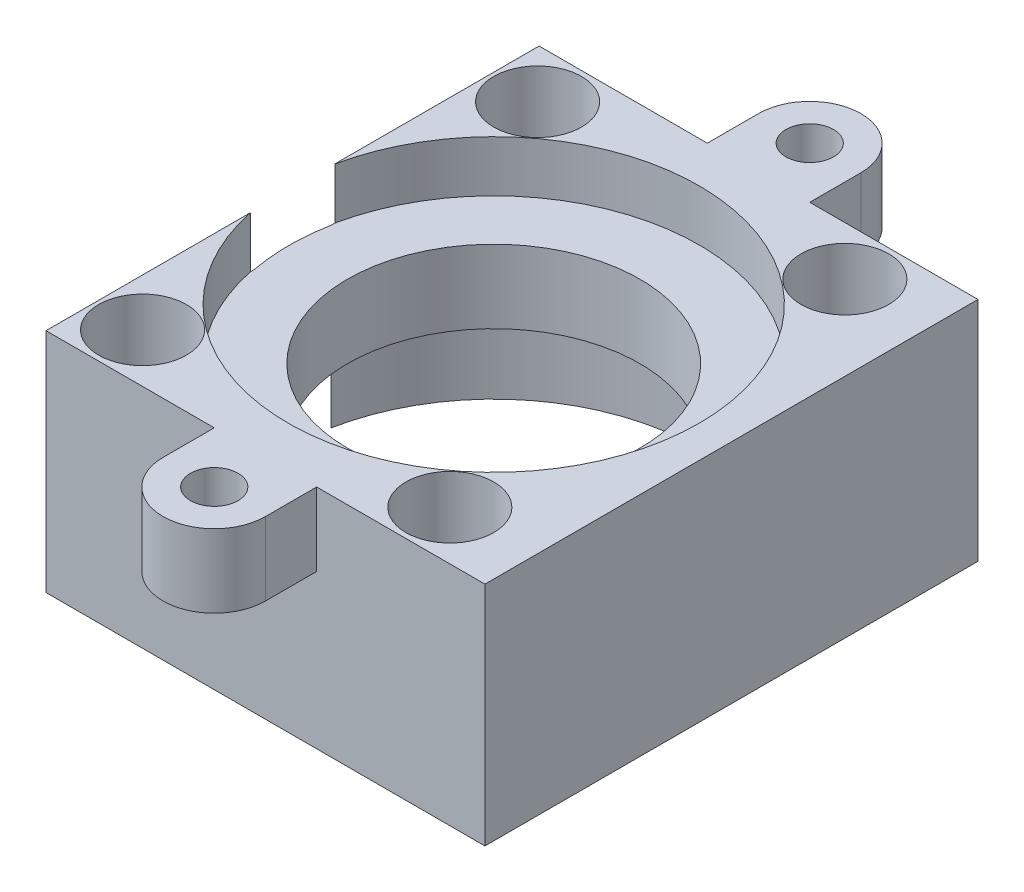
ISO-10303-21;
HEADER;
FILE_DESCRIPTION(('STEP AP214'),'2;1');
FILE_NAME('part.step','',(''),(''),'','','');
FILE_SCHEMA(('AUTOMOTIVE_DESIGN { 1 0 10303 214 1 1 1 1 }'));
ENDSEC;
DATA;
#1=APPLICATION_CONTEXT('core data for automotive mechanical design processes');
#2=APPLICATION_PROTOCOL_DEFINITION('international standard','automotive_design',2000,#1);
#3=PRODUCT_CONTEXT('',#1,'mechanical');
#4=PRODUCT('Part','Part','',(#3));
#5=PRODUCT_RELATED_PRODUCT_CATEGORY('part','',(#4));
#6=PRODUCT_DEFINITION_FORMATION('','',#4);
#7=PRODUCT_DEFINITION_CONTEXT('part definition',#1,'design');
#8=PRODUCT_DEFINITION('design','',#6,#7);
#9=PRODUCT_DEFINITION_SHAPE('','',#8);
#10=(LENGTH_UNIT() NAMED_UNIT(*) SI_UNIT(.MILLI.,.METRE.));
#11=(NAMED_UNIT(*) PLANE_ANGLE_UNIT() SI_UNIT($,.RADIAN.));
#12=(NAMED_UNIT(*) SI_UNIT($,.STERADIAN.) SOLID_ANGLE_UNIT());
#13=UNCERTAINTY_MEASURE_WITH_UNIT(LENGTH_MEASURE(1.E-05),#10,'distance_accuracy_value','');
#14=(GEOMETRIC_REPRESENTATION_CONTEXT(3) GLOBAL_UNCERTAINTY_ASSIGNED_CONTEXT((#13)) GLOBAL_UNIT_ASSIGNED_CONTEXT((#10,
#11,#12)) REPRESENTATION_CONTEXT('',''));
#15=CARTESIAN_POINT('',(0.,0.,0.));
#16=DIRECTION('',(0.,0.,1.));
#17=DIRECTION('',(1.,0.,0.));
#18=AXIS2_PLACEMENT_3D('',#15,#16,#17);
#19=CARTESIAN_POINT('',(-11.75,15.,13.5));
#20=DIRECTION('',(0.,-1.,0.));
#21=DIRECTION('',(0.,0.,-1.));
#22=AXIS2_PLACEMENT_3D('',#19,#20,#21);
#23=CYLINDRICAL_SURFACE('',#22,1.375);
#24=CARTESIAN_POINT('',(-11.75,0.,13.5));
#25=DIRECTION('',(0.,1.,0.));
#26=DIRECTION('',(0.,0.,1.));
#27=AXIS2_PLACEMENT_3D('',#24,#25,#26);
#28=CIRCLE('',#27,1.375);
#29=CARTESIAN_POINT('',(-11.75,0.,14.875));
#30=VERTEX_POINT('',#29);
#31=EDGE_CURVE('E375',#30,#30,#28,.T.);
#32=ORIENTED_EDGE('',*,*,#31,.F.);
#33=EDGE_LOOP('',(#32));
#34=FACE_BOUND('',#33,.T.);
#35=CARTESIAN_POINT('',(-11.75,3.,13.5));
#36=DIRECTION('',(0.,1.,0.));
#37=DIRECTION('',(0.,0.,1.));
#38=AXIS2_PLACEMENT_3D('',#35,#36,#37);
#39=CIRCLE('',#38,1.375);
#40=CARTESIAN_POINT('',(-11.75,3.,14.875));
#41=VERTEX_POINT('',#40);
#42=EDGE_CURVE('E245',#41,#41,#39,.T.);
#43=ORIENTED_EDGE('',*,*,#42,.T.);
#44=EDGE_LOOP('',(#43));
#45=FACE_BOUND('',#44,.T.);
#46=ADVANCED_FACE('F40',(#34,#45),#23,.F.);
#47=CARTESIAN_POINT('',(9.25,15.,13.5));
#48=DIRECTION('',(0.,-1.,0.));
#49=DIRECTION('',(0.,0.,-1.));
#50=AXIS2_PLACEMENT_3D('',#47,#48,#49);
#51=CYLINDRICAL_SURFACE('',#50,1.46084532642088);
#52=CARTESIAN_POINT('',(9.25,0.,13.5));
#53=DIRECTION('',(0.,1.,0.));
#54=DIRECTION('',(0.,0.,1.));
#55=AXIS2_PLACEMENT_3D('',#52,#53,#54);
#56=CIRCLE('',#55,1.46084532642088);
#57=CARTESIAN_POINT('',(9.25,0.,14.9608453264209));
#58=VERTEX_POINT('',#57);
#59=EDGE_CURVE('E371',#58,#58,#56,.T.);
#60=ORIENTED_EDGE('',*,*,#59,.F.);
#61=EDGE_LOOP('',(#60));
#62=FACE_BOUND('',#61,.T.);
#63=CARTESIAN_POINT('',(9.25,3.,13.5));
#64=DIRECTION('',(0.,1.,0.));
#65=DIRECTION('',(0.,0.,1.));
#66=AXIS2_PLACEMENT_3D('',#63,#64,#65);
#67=CIRCLE('',#66,1.46084532642088);
#68=CARTESIAN_POINT('',(9.25,3.,14.9608453264209));
#69=VERTEX_POINT('',#68);
#70=EDGE_CURVE('E409',#69,#69,#67,.T.);
#71=ORIENTED_EDGE('',*,*,#70,.T.);
#72=EDGE_LOOP('',(#71));
#73=FACE_BOUND('',#72,.T.);
#74=ADVANCED_FACE('F465',(#62,#73),#51,.F.);
#75=CARTESIAN_POINT('',(9.24999999999999,15.,-13.5));
#76=DIRECTION('',(0.,-1.,0.));
#77=DIRECTION('',(0.,0.,-1.));
#78=AXIS2_PLACEMENT_3D('',#75,#76,#77);
#79=CYLINDRICAL_SURFACE('',#78,1.48065528185077);
#80=CARTESIAN_POINT('',(9.24999999999999,0.,-13.5));
#81=DIRECTION('',(0.,1.,0.));
#82=DIRECTION('',(0.,0.,1.));
#83=AXIS2_PLACEMENT_3D('',#80,#81,#82);
#84=CIRCLE('',#83,1.48065528185077);
#85=CARTESIAN_POINT('',(9.24999999999999,0.,-12.0193447181492));
#86=VERTEX_POINT('',#85);
#87=EDGE_CURVE('E367',#86,#86,#84,.T.);
#88=ORIENTED_EDGE('',*,*,#87,.F.);
#89=EDGE_LOOP('',(#88));
#90=FACE_BOUND('',#89,.T.);
#91=CARTESIAN_POINT('',(9.24999999999999,3.,-13.5));
#92=DIRECTION('',(0.,1.,0.));
#93=DIRECTION('',(0.,0.,1.));
#94=AXIS2_PLACEMENT_3D('',#91,#92,#93);
#95=CIRCLE('',#94,1.48065528185077);
#96=CARTESIAN_POINT('',(9.24999999999999,3.,-12.0193447181492));
#97=VERTEX_POINT('',#96);
#98=EDGE_CURVE('E405',#97,#97,#95,.T.);
#99=ORIENTED_EDGE('',*,*,#98,.T.);
#100=EDGE_LOOP('',(#99));
#101=FACE_BOUND('',#100,.T.);
#102=ADVANCED_FACE('F472',(#90,#101),#79,.F.);
#103=CARTESIAN_POINT('',(-11.75,15.,-13.5));
#104=DIRECTION('',(0.,-1.,0.));
#105=DIRECTION('',(0.,0.,-1.));
#106=AXIS2_PLACEMENT_3D('',#103,#104,#105);
#107=CYLINDRICAL_SURFACE('',#106,1.375);
#108=CARTESIAN_POINT('',(-11.75,0.,-13.5));
#109=DIRECTION('',(0.,1.,0.));
#110=DIRECTION('',(0.,0.,1.));
#111=AXIS2_PLACEMENT_3D('',#108,#109,#110);
#112=CIRCLE('',#111,1.375);
#113=CARTESIAN_POINT('',(-11.75,0.,-12.125));
#114=VERTEX_POINT('',#113);
#115=EDGE_CURVE('E379',#114,#114,#112,.T.);
#116=ORIENTED_EDGE('',*,*,#115,.F.);
#117=EDGE_LOOP('',(#116));
#118=FACE_BOUND('',#117,.T.);
#119=CARTESIAN_POINT('',(-11.75,3.,-13.5));
#120=DIRECTION('',(0.,1.,0.));
#121=DIRECTION('',(0.,0.,1.));
#122=AXIS2_PLACEMENT_3D('',#119,#120,#121);
#123=CIRCLE('',#122,1.375);
#124=CARTESIAN_POINT('',(-11.75,3.,-12.125));
#125=VERTEX_POINT('',#124);
#126=EDGE_CURVE('E216',#125,#125,#123,.T.);
#127=ORIENTED_EDGE('',*,*,#126,.T.);
#128=EDGE_LOOP('',(#127));
#129=FACE_BOUND('',#128,.T.);
#130=ADVANCED_FACE('F477',(#118,#129),#107,.F.);
#131=CARTESIAN_POINT('',(0.,15.,-16.85));
#132=DIRECTION('',(0.,0.,1.));
#133=DIRECTION('',(1.,0.,0.));
#134=AXIS2_PLACEMENT_3D('',#131,#132,#133);
#135=PLANE('',#134);
#136=DIRECTION('',(0.,1.,0.));
#137=VECTOR('',#136,1.);
#138=CARTESIAN_POINT('',(-3.5,10.5,-16.85));
#139=LINE('',#138,#137);
#140=CARTESIAN_POINT('',(-3.5,10.5,-16.85));
#141=VERTEX_POINT('',#140);
#142=CARTESIAN_POINT('',(-3.5,15.5,-16.85));
#143=VERTEX_POINT('',#142);
#144=EDGE_CURVE('E307',#141,#143,#139,.T.);
#145=ORIENTED_EDGE('',*,*,#144,.F.);
#146=DIRECTION('',(-1.,0.,0.));
#147=VECTOR('',#146,1.);
#148=CARTESIAN_POINT('',(0.,10.5,-16.85));
#149=LINE('',#148,#147);
#150=CARTESIAN_POINT('',(3.5,10.5,-16.85));
#151=VERTEX_POINT('',#150);
#152=EDGE_CURVE('E275',#151,#141,#149,.T.);
#153=ORIENTED_EDGE('',*,*,#152,.F.);
#154=DIRECTION('',(0.,1.,0.));
#155=VECTOR('',#154,1.);
#156=CARTESIAN_POINT('',(3.5,10.5,-16.85));
#157=LINE('',#156,#155);
#158=CARTESIAN_POINT('',(3.5,15.5,-16.85));
#159=VERTEX_POINT('',#158);
#160=EDGE_CURVE('E303',#151,#159,#157,.T.);
#161=ORIENTED_EDGE('',*,*,#160,.T.);
#162=DIRECTION('',(-1.,0.,0.));
#163=VECTOR('',#162,1.);
#164=CARTESIAN_POINT('',(0.,15.5,-16.85));
#165=LINE('',#164,#163);
#166=CARTESIAN_POINT('',(15.,15.5,-16.85));
#167=VERTEX_POINT('',#166);
#168=EDGE_CURVE('E327',#167,#159,#165,.T.);
#169=ORIENTED_EDGE('',*,*,#168,.F.);
#170=DIRECTION('',(0.,-1.,0.));
#171=VECTOR('',#170,1.);
#172=CARTESIAN_POINT('',(15.,15.,-16.85));
#173=LINE('',#172,#171);
#174=CARTESIAN_POINT('',(15.,0.,-16.85));
#175=VERTEX_POINT('',#174);
#176=EDGE_CURVE('E389',#167,#175,#173,.T.);
#177=ORIENTED_EDGE('',*,*,#176,.T.);
#178=DIRECTION('',(-1.,0.,0.));
#179=VECTOR('',#178,1.);
#180=CARTESIAN_POINT('',(0.,0.,-16.85));
#181=LINE('',#180,#179);
#182=CARTESIAN_POINT('',(-15.,0.,-16.85));
#183=VERTEX_POINT('',#182);
#184=EDGE_CURVE('E363',#175,#183,#181,.T.);
#185=ORIENTED_EDGE('',*,*,#184,.T.);
#186=DIRECTION('',(0.,-1.,0.));
#187=VECTOR('',#186,1.);
#188=CARTESIAN_POINT('',(-15.,15.,-16.85));
#189=LINE('',#188,#187);
#190=CARTESIAN_POINT('',(-15.,15.5,-16.85));
#191=VERTEX_POINT('',#190);
#192=EDGE_CURVE('E386',#191,#183,#189,.T.);
#193=ORIENTED_EDGE('',*,*,#192,.F.);
#194=EDGE_CURVE('E326',#143,#191,#165,.T.);
#195=ORIENTED_EDGE('',*,*,#194,.F.);
#196=EDGE_LOOP('',(#145,#153,#161,#169,#177,#185,#193,#195));
#197=FACE_BOUND('',#196,.T.);
#198=ADVANCED_FACE('F488',(#197),#135,.F.);
#199=CARTESIAN_POINT('',(-1.25,7.,0.));
#200=DIRECTION('',(0.,1.,0.));
#201=DIRECTION('',(0.,0.,1.));
#202=AXIS2_PLACEMENT_3D('',#199,#200,#201);
#203=CYLINDRICAL_SURFACE('',#202,14.);
#204=DIRECTION('',(0.,-1.,0.));
#205=VECTOR('',#204,1.);
#206=CARTESIAN_POINT('',(-15.,15.,2.63391343821319));
#207=LINE('',#206,#205);
#208=CARTESIAN_POINT('',(-15.,12.,2.63391343821319));
#209=VERTEX_POINT('',#208);
#210=CARTESIAN_POINT('',(-15.,7.,2.63391343821319));
#211=VERTEX_POINT('',#210);
#212=EDGE_CURVE('E49',#209,#211,#207,.T.);
#213=ORIENTED_EDGE('',*,*,#212,.F.);
#214=CARTESIAN_POINT('',(-1.25,12.,0.));
#215=DIRECTION('',(0.,1.,0.));
#216=DIRECTION('',(0.,0.,1.));
#217=AXIS2_PLACEMENT_3D('',#214,#215,#216);
#218=CIRCLE('',#217,14.);
#219=CARTESIAN_POINT('',(-15.,12.,-2.63391343821319));
#220=VERTEX_POINT('',#219);
#221=EDGE_CURVE('E335',#220,#209,#218,.T.);
#222=ORIENTED_EDGE('',*,*,#221,.F.);
#223=DIRECTION('',(0.,-1.,0.));
#224=VECTOR('',#223,1.);
#225=CARTESIAN_POINT('',(-15.,15.,-2.63391343821319));
#226=LINE('',#225,#224);
#227=CARTESIAN_POINT('',(-15.,7.,-2.63391343821319));
#228=VERTEX_POINT('',#227);
#229=EDGE_CURVE('E179',#220,#228,#226,.T.);
#230=ORIENTED_EDGE('',*,*,#229,.T.);
#231=CARTESIAN_POINT('',(-1.25,7.,0.));
#232=DIRECTION('',(0.,1.,0.));
#233=DIRECTION('',(0.,0.,1.));
#234=AXIS2_PLACEMENT_3D('',#231,#232,#233);
#235=CIRCLE('',#234,14.);
#236=EDGE_CURVE('E343',#228,#211,#235,.T.);
#237=ORIENTED_EDGE('',*,*,#236,.T.);
#238=EDGE_LOOP('',(#213,#222,#230,#237));
#239=FACE_BOUND('',#238,.T.);
#240=ADVANCED_FACE('F491',(#239),#203,.T.);
#241=CARTESIAN_POINT('',(-1.25,7.,0.));
#242=DIRECTION('',(0.,1.,0.));
#243=DIRECTION('',(0.,0.,1.));
#244=AXIS2_PLACEMENT_3D('',#241,#242,#243);
#245=CYLINDRICAL_SURFACE('',#244,10.);
#246=CARTESIAN_POINT('',(-1.25,7.,0.));
#247=DIRECTION('',(0.,1.,0.));
#248=DIRECTION('',(0.,0.,1.));
#249=AXIS2_PLACEMENT_3D('',#246,#247,#248);
#250=CIRCLE('',#249,10.);
#251=CARTESIAN_POINT('',(-1.25,7.,10.));
#252=VERTEX_POINT('',#251);
#253=EDGE_CURVE('E338',#252,#252,#250,.T.);
#254=ORIENTED_EDGE('',*,*,#253,.F.);
#255=EDGE_LOOP('',(#254));
#256=FACE_BOUND('',#255,.T.);
#257=CARTESIAN_POINT('',(-1.25,12.,0.));
#258=DIRECTION('',(0.,1.,0.));
#259=DIRECTION('',(0.,0.,1.));
#260=AXIS2_PLACEMENT_3D('',#257,#258,#259);
#261=CIRCLE('',#260,10.);
#262=CARTESIAN_POINT('',(-1.25,12.,10.));
#263=VERTEX_POINT('',#262);
#264=EDGE_CURVE('E331',#263,#263,#261,.T.);
#265=ORIENTED_EDGE('',*,*,#264,.T.);
#266=EDGE_LOOP('',(#265));
#267=FACE_BOUND('',#266,.T.);
#268=ADVANCED_FACE('F561',(#256,#267),#245,.F.);
#269=CARTESIAN_POINT('',(-1.25,15.,0.));
#270=DIRECTION('',(0.,-1.,0.));
#271=DIRECTION('',(0.,0.,-1.));
#272=AXIS2_PLACEMENT_3D('',#269,#270,#271);
#273=CYLINDRICAL_SURFACE('',#272,14.);
#274=CARTESIAN_POINT('',(-15.,0.,2.63391343821319));
#275=VERTEX_POINT('',#274);
#276=EDGE_CURVE('E399',#211,#275,#207,.T.);
#277=ORIENTED_EDGE('',*,*,#276,.F.);
#278=EDGE_CURVE('E342',#211,#228,#235,.T.);
#279=ORIENTED_EDGE('',*,*,#278,.T.);
#280=CARTESIAN_POINT('',(-15.,0.,-2.63391343821319));
#281=VERTEX_POINT('',#280);
#282=EDGE_CURVE('E383',#228,#281,#226,.T.);
#283=ORIENTED_EDGE('',*,*,#282,.T.);
#284=CARTESIAN_POINT('',(-1.25,0.,0.));
#285=DIRECTION('',(0.,1.,0.));
#286=DIRECTION('',(0.,0.,1.));
#287=AXIS2_PLACEMENT_3D('',#284,#285,#286);
#288=CIRCLE('',#287,14.);
#289=EDGE_CURVE('E347',#275,#281,#288,.T.);
#290=ORIENTED_EDGE('',*,*,#289,.F.);
#291=EDGE_LOOP('',(#277,#279,#283,#290));
#292=FACE_BOUND('',#291,.T.);
#293=ADVANCED_FACE('F42',(#292),#273,.F.);
#294=CARTESIAN_POINT('',(-15.,15.,0.));
#295=DIRECTION('',(-1.,0.,0.));
#296=DIRECTION('',(0.,0.,1.));
#297=AXIS2_PLACEMENT_3D('',#294,#295,#296);
#298=PLANE('',#297);
#299=DIRECTION('',(0.,1.,0.));
#300=VECTOR('',#299,1.);
#301=CARTESIAN_POINT('',(-15.,12.,2.88790581563874));
#302=LINE('',#301,#300);
#303=CARTESIAN_POINT('',(-15.,12.,2.88790581563874));
#304=VERTEX_POINT('',#303);
#305=CARTESIAN_POINT('',(-15.,15.5,2.88790581563874));
#306=VERTEX_POINT('',#305);
#307=EDGE_CURVE('E55',#304,#306,#302,.T.);
#308=ORIENTED_EDGE('',*,*,#307,.F.);
#309=DIRECTION('',(0.,0.,-1.));
#310=VECTOR('',#309,1.);
#311=CARTESIAN_POINT('',(-15.,12.,0.));
#312=LINE('',#311,#310);
#313=EDGE_CURVE('E173',#304,#209,#312,.T.);
#314=ORIENTED_EDGE('',*,*,#313,.T.);
#315=ORIENTED_EDGE('',*,*,#212,.T.);
#316=ORIENTED_EDGE('',*,*,#276,.T.);
#317=DIRECTION('',(0.,0.,-1.));
#318=VECTOR('',#317,1.);
#319=CARTESIAN_POINT('',(-15.,0.,0.));
#320=LINE('',#319,#318);
#321=CARTESIAN_POINT('',(-15.,0.,16.85));
#322=VERTEX_POINT('',#321);
#323=EDGE_CURVE('E351',#322,#275,#320,.T.);
#324=ORIENTED_EDGE('',*,*,#323,.F.);
#325=DIRECTION('',(0.,-1.,0.));
#326=VECTOR('',#325,1.);
#327=CARTESIAN_POINT('',(-15.,15.,16.85));
#328=LINE('',#327,#326);
#329=CARTESIAN_POINT('',(-15.,15.5,16.85));
#330=VERTEX_POINT('',#329);
#331=EDGE_CURVE('E396',#330,#322,#328,.T.);
#332=ORIENTED_EDGE('',*,*,#331,.F.);
#333=DIRECTION('',(0.,0.,1.));
#334=VECTOR('',#333,1.);
#335=CARTESIAN_POINT('',(-15.,15.5,0.));
#336=LINE('',#335,#334);
#337=EDGE_CURVE('E314',#306,#330,#336,.T.);
#338=ORIENTED_EDGE('',*,*,#337,.F.);
#339=EDGE_LOOP('',(#308,#314,#315,#316,#324,#332,#338));
#340=FACE_BOUND('',#339,.T.);
#341=ADVANCED_FACE('F487',(#340),#298,.T.);
#342=CARTESIAN_POINT('',(0.,15.,16.85));
#343=DIRECTION('',(0.,0.,1.));
#344=DIRECTION('',(1.,0.,0.));
#345=AXIS2_PLACEMENT_3D('',#342,#343,#344);
#346=PLANE('',#345);
#347=DIRECTION('',(0.,1.,0.));
#348=VECTOR('',#347,1.);
#349=CARTESIAN_POINT('',(3.5,10.5,16.85));
#350=LINE('',#349,#348);
#351=CARTESIAN_POINT('',(3.5,10.5,16.85));
#352=VERTEX_POINT('',#351);
#353=CARTESIAN_POINT('',(3.5,15.5,16.85));
#354=VERTEX_POINT('',#353);
#355=EDGE_CURVE('E261',#352,#354,#350,.T.);
#356=ORIENTED_EDGE('',*,*,#355,.F.);
#357=DIRECTION('',(1.,0.,0.));
#358=VECTOR('',#357,1.);
#359=CARTESIAN_POINT('',(0.,10.5,16.85));
#360=LINE('',#359,#358);
#361=CARTESIAN_POINT('',(-3.5,10.5,16.85));
#362=VERTEX_POINT('',#361);
#363=EDGE_CURVE('E228',#362,#352,#360,.T.);
#364=ORIENTED_EDGE('',*,*,#363,.F.);
#365=DIRECTION('',(0.,1.,0.));
#366=VECTOR('',#365,1.);
#367=CARTESIAN_POINT('',(-3.5,10.5,16.85));
#368=LINE('',#367,#366);
#369=CARTESIAN_POINT('',(-3.5,15.5,16.85));
#370=VERTEX_POINT('',#369);
#371=EDGE_CURVE('E258',#362,#370,#368,.T.);
#372=ORIENTED_EDGE('',*,*,#371,.T.);
#373=DIRECTION('',(1.,0.,0.));
#374=VECTOR('',#373,1.);
#375=CARTESIAN_POINT('',(0.,15.5,16.85));
#376=LINE('',#375,#374);
#377=EDGE_CURVE('E318',#330,#370,#376,.T.);
#378=ORIENTED_EDGE('',*,*,#377,.F.);
#379=ORIENTED_EDGE('',*,*,#331,.T.);
#380=DIRECTION('',(-1.,0.,0.));
#381=VECTOR('',#380,1.);
#382=CARTESIAN_POINT('',(0.,0.,16.85));
#383=LINE('',#382,#381);
#384=CARTESIAN_POINT('',(15.,0.,16.85));
#385=VERTEX_POINT('',#384);
#386=EDGE_CURVE('E355',#385,#322,#383,.T.);
#387=ORIENTED_EDGE('',*,*,#386,.F.);
#388=DIRECTION('',(0.,-1.,0.));
#389=VECTOR('',#388,1.);
#390=CARTESIAN_POINT('',(15.,15.,16.85));
#391=LINE('',#390,#389);
#392=CARTESIAN_POINT('',(15.,15.5,16.85));
#393=VERTEX_POINT('',#392);
#394=EDGE_CURVE('E393',#393,#385,#391,.T.);
#395=ORIENTED_EDGE('',*,*,#394,.F.);
#396=EDGE_CURVE('E317',#354,#393,#376,.T.);
#397=ORIENTED_EDGE('',*,*,#396,.F.);
#398=EDGE_LOOP('',(#356,#364,#372,#378,#379,#387,#395,#397));
#399=FACE_BOUND('',#398,.T.);
#400=ADVANCED_FACE('F494',(#399),#346,.T.);
#401=CARTESIAN_POINT('',(15.,15.,0.));
#402=DIRECTION('',(-1.,0.,0.));
#403=DIRECTION('',(0.,0.,1.));
#404=AXIS2_PLACEMENT_3D('',#401,#402,#403);
#405=PLANE('',#404);
#406=DIRECTION('',(0.,0.,-1.));
#407=VECTOR('',#406,1.);
#408=CARTESIAN_POINT('',(15.,0.,0.));
#409=LINE('',#408,#407);
#410=EDGE_CURVE('E360',#385,#175,#409,.T.);
#411=ORIENTED_EDGE('',*,*,#410,.T.);
#412=ORIENTED_EDGE('',*,*,#176,.F.);
#413=DIRECTION('',(0.,0.,-1.));
#414=VECTOR('',#413,1.);
#415=CARTESIAN_POINT('',(15.,15.5,0.));
#416=LINE('',#415,#414);
#417=EDGE_CURVE('E322',#393,#167,#416,.T.);
#418=ORIENTED_EDGE('',*,*,#417,.F.);
#419=ORIENTED_EDGE('',*,*,#394,.T.);
#420=EDGE_LOOP('',(#411,#412,#418,#419));
#421=FACE_BOUND('',#420,.T.);
#422=ADVANCED_FACE('F486',(#421),#405,.F.);
#423=DIRECTION('',(0.,1.,0.));
#424=VECTOR('',#423,1.);
#425=CARTESIAN_POINT('',(-15.,12.,-2.88790581563874));
#426=LINE('',#425,#424);
#427=CARTESIAN_POINT('',(-15.,15.5,-2.88790581563874));
#428=VERTEX_POINT('',#427);
#429=CARTESIAN_POINT('',(-15.,12.,-2.88790581563874));
#430=VERTEX_POINT('',#429);
#431=EDGE_CURVE('E158',#428,#430,#426,.F.);
#432=ORIENTED_EDGE('',*,*,#431,.F.);
#433=DIRECTION('',(0.,0.,1.));
#434=VECTOR('',#433,1.);
#435=CARTESIAN_POINT('',(-15.,15.5,0.));
#436=LINE('',#435,#434);
#437=EDGE_CURVE('E302',#191,#428,#436,.T.);
#438=ORIENTED_EDGE('',*,*,#437,.F.);
#439=ORIENTED_EDGE('',*,*,#192,.T.);
#440=EDGE_CURVE('E356',#281,#183,#320,.T.);
#441=ORIENTED_EDGE('',*,*,#440,.F.);
#442=ORIENTED_EDGE('',*,*,#282,.F.);
#443=ORIENTED_EDGE('',*,*,#229,.F.);
#444=DIRECTION('',(0.,0.,-1.));
#445=VECTOR('',#444,1.);
#446=CARTESIAN_POINT('',(-15.,12.,0.));
#447=LINE('',#446,#445);
#448=EDGE_CURVE('E171',#220,#430,#447,.T.);
#449=ORIENTED_EDGE('',*,*,#448,.T.);
#450=EDGE_LOOP('',(#432,#438,#439,#441,#442,#443,#449));
#451=FACE_BOUND('',#450,.T.);
#452=ADVANCED_FACE('F177',(#451),#298,.T.);
#453=CARTESIAN_POINT('',(0.,0.,0.));
#454=DIRECTION('',(0.,1.,0.));
#455=DIRECTION('',(0.,0.,1.));
#456=AXIS2_PLACEMENT_3D('',#453,#454,#455);
#457=PLANE('',#456);
#458=ORIENTED_EDGE('',*,*,#289,.T.);
#459=ORIENTED_EDGE('',*,*,#440,.T.);
#460=ORIENTED_EDGE('',*,*,#184,.F.);
#461=ORIENTED_EDGE('',*,*,#410,.F.);
#462=ORIENTED_EDGE('',*,*,#386,.T.);
#463=ORIENTED_EDGE('',*,*,#323,.T.);
#464=EDGE_LOOP('',(#458,#459,#460,#461,#462,#463));
#465=FACE_BOUND('',#464,.T.);
#466=ORIENTED_EDGE('',*,*,#87,.T.);
#467=EDGE_LOOP('',(#466));
#468=FACE_BOUND('',#467,.T.);
#469=ORIENTED_EDGE('',*,*,#59,.T.);
#470=EDGE_LOOP('',(#469));
#471=FACE_BOUND('',#470,.T.);
#472=ORIENTED_EDGE('',*,*,#31,.T.);
#473=EDGE_LOOP('',(#472));
#474=FACE_BOUND('',#473,.T.);
#475=ORIENTED_EDGE('',*,*,#115,.T.);
#476=EDGE_LOOP('',(#475));
#477=FACE_BOUND('',#476,.T.);
#478=ADVANCED_FACE('F485',(#465,#468,#471,#474,#477),#457,.F.);
#479=CARTESIAN_POINT('',(-1.25,7.,0.));
#480=DIRECTION('',(0.,1.,0.));
#481=DIRECTION('',(0.,0.,1.));
#482=AXIS2_PLACEMENT_3D('',#479,#480,#481);
#483=PLANE('',#482);
#484=ORIENTED_EDGE('',*,*,#253,.T.);
#485=EDGE_LOOP('',(#484));
#486=FACE_BOUND('',#485,.T.);
#487=ORIENTED_EDGE('',*,*,#236,.F.);
#488=ORIENTED_EDGE('',*,*,#278,.F.);
#489=EDGE_LOOP('',(#487,#488));
#490=FACE_BOUND('',#489,.T.);
#491=ADVANCED_FACE('F558',(#486,#490),#483,.F.);
#492=CARTESIAN_POINT('',(-1.25,12.,0.));
#493=DIRECTION('',(0.,1.,0.));
#494=DIRECTION('',(0.,0.,1.));
#495=AXIS2_PLACEMENT_3D('',#492,#493,#494);
#496=PLANE('',#495);
#497=ORIENTED_EDGE('',*,*,#264,.F.);
#498=EDGE_LOOP('',(#497));
#499=FACE_BOUND('',#498,.T.);
#500=ORIENTED_EDGE('',*,*,#221,.T.);
#501=ORIENTED_EDGE('',*,*,#313,.F.);
#502=CARTESIAN_POINT('',(-1.25,12.,0.));
#503=DIRECTION('',(0.,1.,0.));
#504=DIRECTION('',(0.,0.,1.));
#505=AXIS2_PLACEMENT_3D('',#502,#503,#504);
#506=CIRCLE('',#505,14.05);
#507=EDGE_CURVE('E161',#304,#430,#506,.T.);
#508=ORIENTED_EDGE('',*,*,#507,.T.);
#509=ORIENTED_EDGE('',*,*,#448,.F.);
#510=EDGE_LOOP('',(#500,#501,#508,#509));
#511=FACE_BOUND('',#510,.T.);
#512=ADVANCED_FACE('F170',(#499,#511),#496,.T.);
#513=CARTESIAN_POINT('',(0.,15.5,0.));
#514=DIRECTION('',(0.,1.,0.));
#515=DIRECTION('',(0.,0.,1.));
#516=AXIS2_PLACEMENT_3D('',#513,#514,#515);
#517=PLANE('',#516);
#518=CARTESIAN_POINT('',(-1.25,15.5,0.));
#519=DIRECTION('',(0.,1.,0.));
#520=DIRECTION('',(0.,0.,1.));
#521=AXIS2_PLACEMENT_3D('',#518,#519,#520);
#522=CIRCLE('',#521,14.05);
#523=EDGE_CURVE('E11',#306,#428,#522,.T.);
#524=ORIENTED_EDGE('',*,*,#523,.F.);
#525=ORIENTED_EDGE('',*,*,#337,.T.);
#526=ORIENTED_EDGE('',*,*,#377,.T.);
#527=DIRECTION('',(0.,0.,1.));
#528=VECTOR('',#527,1.);
#529=CARTESIAN_POINT('',(-3.5,15.5,0.));
#530=LINE('',#529,#528);
#531=CARTESIAN_POINT('',(-3.5,15.5,20.35));
#532=VERTEX_POINT('',#531);
#533=EDGE_CURVE('E63',#370,#532,#530,.T.);
#534=ORIENTED_EDGE('',*,*,#533,.T.);
#535=CARTESIAN_POINT('',(0.,15.5,20.35));
#536=DIRECTION('',(0.,1.,0.));
#537=DIRECTION('',(0.,0.,1.));
#538=AXIS2_PLACEMENT_3D('',#535,#536,#537);
#539=CIRCLE('',#538,3.5);
#540=CARTESIAN_POINT('',(3.5,15.5,20.35));
#541=VERTEX_POINT('',#540);
#542=EDGE_CURVE('E240',#532,#541,#539,.T.);
#543=ORIENTED_EDGE('',*,*,#542,.T.);
#544=DIRECTION('',(0.,0.,1.));
#545=VECTOR('',#544,1.);
#546=CARTESIAN_POINT('',(3.5,15.5,0.));
#547=LINE('',#546,#545);
#548=EDGE_CURVE('E244',#354,#541,#547,.T.);
#549=ORIENTED_EDGE('',*,*,#548,.F.);
#550=ORIENTED_EDGE('',*,*,#396,.T.);
#551=ORIENTED_EDGE('',*,*,#417,.T.);
#552=ORIENTED_EDGE('',*,*,#168,.T.);
#553=DIRECTION('',(0.,0.,1.));
#554=VECTOR('',#553,1.);
#555=CARTESIAN_POINT('',(3.5,15.5,0.));
#556=LINE('',#555,#554);
#557=CARTESIAN_POINT('',(3.5,15.5,-20.35));
#558=VERTEX_POINT('',#557);
#559=EDGE_CURVE('E293',#558,#159,#556,.T.);
#560=ORIENTED_EDGE('',*,*,#559,.F.);
#561=CARTESIAN_POINT('',(0.,15.5,-20.35));
#562=DIRECTION('',(0.,1.,0.));
#563=DIRECTION('',(0.,0.,1.));
#564=AXIS2_PLACEMENT_3D('',#561,#562,#563);
#565=CIRCLE('',#564,3.5);
#566=CARTESIAN_POINT('',(-3.5,15.5,-20.35));
#567=VERTEX_POINT('',#566);
#568=EDGE_CURVE('E257',#558,#567,#565,.T.);
#569=ORIENTED_EDGE('',*,*,#568,.T.);
#570=DIRECTION('',(0.,0.,1.));
#571=VECTOR('',#570,1.);
#572=CARTESIAN_POINT('',(-3.5,15.5,0.));
#573=LINE('',#572,#571);
#574=EDGE_CURVE('E289',#567,#143,#573,.T.);
#575=ORIENTED_EDGE('',*,*,#574,.T.);
#576=ORIENTED_EDGE('',*,*,#194,.T.);
#577=ORIENTED_EDGE('',*,*,#437,.T.);
#578=EDGE_LOOP('',(#524,#525,#526,#534,#543,#549,#550,#551,#552,#560,#569,#575,#576,#577));
#579=FACE_BOUND('',#578,.T.);
#580=CARTESIAN_POINT('',(-11.75,15.5,13.5));
#581=DIRECTION('',(0.,1.,0.));
#582=DIRECTION('',(0.,0.,1.));
#583=AXIS2_PLACEMENT_3D('',#580,#581,#582);
#584=CIRCLE('',#583,3.);
#585=CARTESIAN_POINT('',(-11.75,15.5,16.5));
#586=VERTEX_POINT('',#585);
#587=EDGE_CURVE('E184',#586,#586,#584,.T.);
#588=ORIENTED_EDGE('',*,*,#587,.F.);
#589=EDGE_LOOP('',(#588));
#590=FACE_BOUND('',#589,.T.);
#591=CARTESIAN_POINT('',(9.25,15.5,13.5));
#592=DIRECTION('',(0.,1.,0.));
#593=DIRECTION('',(0.,0.,1.));
#594=AXIS2_PLACEMENT_3D('',#591,#592,#593);
#595=CIRCLE('',#594,3.);
#596=CARTESIAN_POINT('',(9.25,15.5,16.5));
#597=VERTEX_POINT('',#596);
#598=EDGE_CURVE('E201',#597,#597,#595,.T.);
#599=ORIENTED_EDGE('',*,*,#598,.F.);
#600=EDGE_LOOP('',(#599));
#601=FACE_BOUND('',#600,.T.);
#602=CARTESIAN_POINT('',(9.24999999999999,15.5,-13.5));
#603=DIRECTION('',(0.,1.,0.));
#604=DIRECTION('',(0.,0.,1.));
#605=AXIS2_PLACEMENT_3D('',#602,#603,#604);
#606=CIRCLE('',#605,3.);
#607=CARTESIAN_POINT('',(9.24999999999999,15.5,-10.5));
#608=VERTEX_POINT('',#607);
#609=EDGE_CURVE('E193',#608,#608,#606,.T.);
#610=ORIENTED_EDGE('',*,*,#609,.F.);
#611=EDGE_LOOP('',(#610));
#612=FACE_BOUND('',#611,.T.);
#613=CARTESIAN_POINT('',(-11.75,15.5,-13.5));
#614=DIRECTION('',(0.,1.,0.));
#615=DIRECTION('',(0.,0.,1.));
#616=AXIS2_PLACEMENT_3D('',#613,#614,#615);
#617=CIRCLE('',#616,3.);
#618=CARTESIAN_POINT('',(-11.75,15.5,-10.5));
#619=VERTEX_POINT('',#618);
#620=EDGE_CURVE('E192',#619,#619,#617,.T.);
#621=ORIENTED_EDGE('',*,*,#620,.F.);
#622=EDGE_LOOP('',(#621));
#623=FACE_BOUND('',#622,.T.);
#624=CARTESIAN_POINT('',(0.,15.5,-20.35));
#625=DIRECTION('',(0.,1.,0.));
#626=DIRECTION('',(0.,0.,1.));
#627=AXIS2_PLACEMENT_3D('',#624,#625,#626);
#628=CIRCLE('',#627,1.625);
#629=CARTESIAN_POINT('',(0.,15.5,-18.725));
#630=VERTEX_POINT('',#629);
#631=EDGE_CURVE('E271',#630,#630,#628,.T.);
#632=ORIENTED_EDGE('',*,*,#631,.F.);
#633=EDGE_LOOP('',(#632));
#634=FACE_BOUND('',#633,.T.);
#635=CARTESIAN_POINT('',(0.,15.5,20.35));
#636=DIRECTION('',(0.,1.,0.));
#637=DIRECTION('',(0.,0.,1.));
#638=AXIS2_PLACEMENT_3D('',#635,#636,#637);
#639=CIRCLE('',#638,1.625);
#640=CARTESIAN_POINT('',(0.,15.5,21.975));
#641=VERTEX_POINT('',#640);
#642=EDGE_CURVE('E225',#641,#641,#639,.T.);
#643=ORIENTED_EDGE('',*,*,#642,.F.);
#644=EDGE_LOOP('',(#643));
#645=FACE_BOUND('',#644,.T.);
#646=ADVANCED_FACE('F430',(#579,#590,#601,#612,#623,#634,#645),#517,.T.);
#647=CARTESIAN_POINT('',(0.,10.5,-20.35));
#648=DIRECTION('',(0.,1.,0.));
#649=DIRECTION('',(0.,0.,1.));
#650=AXIS2_PLACEMENT_3D('',#647,#648,#649);
#651=CYLINDRICAL_SURFACE('',#650,3.5);
#652=ORIENTED_EDGE('',*,*,#568,.F.);
#653=DIRECTION('',(0.,1.,0.));
#654=VECTOR('',#653,1.);
#655=CARTESIAN_POINT('',(3.5,10.5,-20.35));
#656=LINE('',#655,#654);
#657=CARTESIAN_POINT('',(3.5,10.5,-20.35));
#658=VERTEX_POINT('',#657);
#659=EDGE_CURVE('E299',#658,#558,#656,.T.);
#660=ORIENTED_EDGE('',*,*,#659,.F.);
#661=CARTESIAN_POINT('',(0.,10.5,-20.35));
#662=DIRECTION('',(0.,1.,0.));
#663=DIRECTION('',(0.,0.,1.));
#664=AXIS2_PLACEMENT_3D('',#661,#662,#663);
#665=CIRCLE('',#664,3.5);
#666=CARTESIAN_POINT('',(-3.5,10.5,-20.35));
#667=VERTEX_POINT('',#666);
#668=EDGE_CURVE('E266',#658,#667,#665,.T.);
#669=ORIENTED_EDGE('',*,*,#668,.T.);
#670=DIRECTION('',(0.,1.,0.));
#671=VECTOR('',#670,1.);
#672=CARTESIAN_POINT('',(-3.5,10.5,-20.35));
#673=LINE('',#672,#671);
#674=EDGE_CURVE('E285',#667,#567,#673,.T.);
#675=ORIENTED_EDGE('',*,*,#674,.T.);
#676=EDGE_LOOP('',(#652,#660,#669,#675));
#677=FACE_BOUND('',#676,.T.);
#678=ADVANCED_FACE('F433',(#677),#651,.T.);
#679=CARTESIAN_POINT('',(3.5,10.5,0.));
#680=DIRECTION('',(-1.,0.,0.));
#681=DIRECTION('',(0.,0.,1.));
#682=AXIS2_PLACEMENT_3D('',#679,#680,#681);
#683=PLANE('',#682);
#684=ORIENTED_EDGE('',*,*,#559,.T.);
#685=ORIENTED_EDGE('',*,*,#160,.F.);
#686=DIRECTION('',(0.,0.,1.));
#687=VECTOR('',#686,1.);
#688=CARTESIAN_POINT('',(3.5,10.5,0.));
#689=LINE('',#688,#687);
#690=EDGE_CURVE('E278',#658,#151,#689,.T.);
#691=ORIENTED_EDGE('',*,*,#690,.F.);
#692=ORIENTED_EDGE('',*,*,#659,.T.);
#693=EDGE_LOOP('',(#684,#685,#691,#692));
#694=FACE_BOUND('',#693,.T.);
#695=ADVANCED_FACE('F591',(#694),#683,.F.);
#696=CARTESIAN_POINT('',(-3.5,10.5,0.));
#697=DIRECTION('',(-1.,0.,0.));
#698=DIRECTION('',(0.,0.,1.));
#699=AXIS2_PLACEMENT_3D('',#696,#697,#698);
#700=PLANE('',#699);
#701=ORIENTED_EDGE('',*,*,#574,.F.);
#702=ORIENTED_EDGE('',*,*,#674,.F.);
#703=DIRECTION('',(0.,0.,1.));
#704=VECTOR('',#703,1.);
#705=CARTESIAN_POINT('',(-3.5,10.5,0.));
#706=LINE('',#705,#704);
#707=EDGE_CURVE('E270',#667,#141,#706,.T.);
#708=ORIENTED_EDGE('',*,*,#707,.T.);
#709=ORIENTED_EDGE('',*,*,#144,.T.);
#710=EDGE_LOOP('',(#701,#702,#708,#709));
#711=FACE_BOUND('',#710,.T.);
#712=ADVANCED_FACE('F541',(#711),#700,.T.);
#713=CARTESIAN_POINT('',(0.,10.5,-20.35));
#714=DIRECTION('',(0.,1.,0.));
#715=DIRECTION('',(0.,0.,1.));
#716=AXIS2_PLACEMENT_3D('',#713,#714,#715);
#717=CYLINDRICAL_SURFACE('',#716,1.625);
#718=CARTESIAN_POINT('',(0.,10.5,-20.35));
#719=DIRECTION('',(0.,1.,0.));
#720=DIRECTION('',(0.,0.,1.));
#721=AXIS2_PLACEMENT_3D('',#718,#719,#720);
#722=CIRCLE('',#721,1.625);
#723=CARTESIAN_POINT('',(0.,10.5,-18.725));
#724=VERTEX_POINT('',#723);
#725=EDGE_CURVE('E281',#724,#724,#722,.T.);
#726=ORIENTED_EDGE('',*,*,#725,.F.);
#727=EDGE_LOOP('',(#726));
#728=FACE_BOUND('',#727,.T.);
#729=ORIENTED_EDGE('',*,*,#631,.T.);
#730=EDGE_LOOP('',(#729));
#731=FACE_BOUND('',#730,.T.);
#732=ADVANCED_FACE('F594',(#728,#731),#717,.F.);
#733=CARTESIAN_POINT('',(0.,10.5,0.));
#734=DIRECTION('',(0.,1.,0.));
#735=DIRECTION('',(0.,0.,1.));
#736=AXIS2_PLACEMENT_3D('',#733,#734,#735);
#737=PLANE('',#736);
#738=ORIENTED_EDGE('',*,*,#668,.F.);
#739=ORIENTED_EDGE('',*,*,#690,.T.);
#740=ORIENTED_EDGE('',*,*,#152,.T.);
#741=ORIENTED_EDGE('',*,*,#707,.F.);
#742=EDGE_LOOP('',(#738,#739,#740,#741));
#743=FACE_BOUND('',#742,.T.);
#744=ORIENTED_EDGE('',*,*,#725,.T.);
#745=EDGE_LOOP('',(#744));
#746=FACE_BOUND('',#745,.T.);
#747=ADVANCED_FACE('F599',(#743,#746),#737,.F.);
#748=CARTESIAN_POINT('',(0.,10.5,20.35));
#749=DIRECTION('',(0.,1.,0.));
#750=DIRECTION('',(0.,0.,1.));
#751=AXIS2_PLACEMENT_3D('',#748,#749,#750);
#752=CYLINDRICAL_SURFACE('',#751,3.5);
#753=ORIENTED_EDGE('',*,*,#542,.F.);
#754=DIRECTION('',(0.,1.,0.));
#755=VECTOR('',#754,1.);
#756=CARTESIAN_POINT('',(-3.5,10.5,20.35));
#757=LINE('',#756,#755);
#758=CARTESIAN_POINT('',(-3.5,10.5,20.35));
#759=VERTEX_POINT('',#758);
#760=EDGE_CURVE('E254',#759,#532,#757,.T.);
#761=ORIENTED_EDGE('',*,*,#760,.F.);
#762=CARTESIAN_POINT('',(0.,10.5,20.35));
#763=DIRECTION('',(0.,1.,0.));
#764=DIRECTION('',(0.,0.,1.));
#765=AXIS2_PLACEMENT_3D('',#762,#763,#764);
#766=CIRCLE('',#765,3.5);
#767=CARTESIAN_POINT('',(3.5,10.5,20.35));
#768=VERTEX_POINT('',#767);
#769=EDGE_CURVE('E220',#759,#768,#766,.T.);
#770=ORIENTED_EDGE('',*,*,#769,.T.);
#771=DIRECTION('',(0.,1.,0.));
#772=VECTOR('',#771,1.);
#773=CARTESIAN_POINT('',(3.5,10.5,20.35));
#774=LINE('',#773,#772);
#775=EDGE_CURVE('E239',#768,#541,#774,.T.);
#776=ORIENTED_EDGE('',*,*,#775,.T.);
#777=EDGE_LOOP('',(#753,#761,#770,#776));
#778=FACE_BOUND('',#777,.T.);
#779=ADVANCED_FACE('F512',(#778),#752,.T.);
#780=CARTESIAN_POINT('',(-3.5,10.5,0.));
#781=DIRECTION('',(-1.,0.,0.));
#782=DIRECTION('',(0.,0.,1.));
#783=AXIS2_PLACEMENT_3D('',#780,#781,#782);
#784=PLANE('',#783);
#785=ORIENTED_EDGE('',*,*,#533,.F.);
#786=ORIENTED_EDGE('',*,*,#371,.F.);
#787=DIRECTION('',(0.,0.,1.));
#788=VECTOR('',#787,1.);
#789=CARTESIAN_POINT('',(-3.5,10.5,0.));
#790=LINE('',#789,#788);
#791=EDGE_CURVE('E231',#362,#759,#790,.T.);
#792=ORIENTED_EDGE('',*,*,#791,.T.);
#793=ORIENTED_EDGE('',*,*,#760,.T.);
#794=EDGE_LOOP('',(#785,#786,#792,#793));
#795=FACE_BOUND('',#794,.T.);
#796=ADVANCED_FACE('F459',(#795),#784,.T.);
#797=CARTESIAN_POINT('',(3.5,10.5,0.));
#798=DIRECTION('',(-1.,0.,0.));
#799=DIRECTION('',(0.,0.,1.));
#800=AXIS2_PLACEMENT_3D('',#797,#798,#799);
#801=PLANE('',#800);
#802=ORIENTED_EDGE('',*,*,#548,.T.);
#803=ORIENTED_EDGE('',*,*,#775,.F.);
#804=DIRECTION('',(0.,0.,1.));
#805=VECTOR('',#804,1.);
#806=CARTESIAN_POINT('',(3.5,10.5,0.));
#807=LINE('',#806,#805);
#808=EDGE_CURVE('E224',#352,#768,#807,.T.);
#809=ORIENTED_EDGE('',*,*,#808,.F.);
#810=ORIENTED_EDGE('',*,*,#355,.T.);
#811=EDGE_LOOP('',(#802,#803,#809,#810));
#812=FACE_BOUND('',#811,.T.);
#813=ADVANCED_FACE('F449',(#812),#801,.F.);
#814=CARTESIAN_POINT('',(0.,10.5,20.35));
#815=DIRECTION('',(0.,1.,0.));
#816=DIRECTION('',(0.,0.,1.));
#817=AXIS2_PLACEMENT_3D('',#814,#815,#816);
#818=CYLINDRICAL_SURFACE('',#817,1.625);
#819=CARTESIAN_POINT('',(0.,10.5,20.35));
#820=DIRECTION('',(0.,1.,0.));
#821=DIRECTION('',(0.,0.,1.));
#822=AXIS2_PLACEMENT_3D('',#819,#820,#821);
#823=CIRCLE('',#822,1.625);
#824=CARTESIAN_POINT('',(0.,10.5,21.975));
#825=VERTEX_POINT('',#824);
#826=EDGE_CURVE('E235',#825,#825,#823,.T.);
#827=ORIENTED_EDGE('',*,*,#826,.F.);
#828=EDGE_LOOP('',(#827));
#829=FACE_BOUND('',#828,.T.);
#830=ORIENTED_EDGE('',*,*,#642,.T.);
#831=EDGE_LOOP('',(#830));
#832=FACE_BOUND('',#831,.T.);
#833=ADVANCED_FACE('F446',(#829,#832),#818,.F.);
#834=CARTESIAN_POINT('',(0.,10.5,0.));
#835=DIRECTION('',(0.,1.,0.));
#836=DIRECTION('',(0.,0.,1.));
#837=AXIS2_PLACEMENT_3D('',#834,#835,#836);
#838=PLANE('',#837);
#839=ORIENTED_EDGE('',*,*,#769,.F.);
#840=ORIENTED_EDGE('',*,*,#791,.F.);
#841=ORIENTED_EDGE('',*,*,#363,.T.);
#842=ORIENTED_EDGE('',*,*,#808,.T.);
#843=EDGE_LOOP('',(#839,#840,#841,#842));
#844=FACE_BOUND('',#843,.T.);
#845=ORIENTED_EDGE('',*,*,#826,.T.);
#846=EDGE_LOOP('',(#845));
#847=FACE_BOUND('',#846,.T.);
#848=ADVANCED_FACE('F448',(#844,#847),#838,.F.);
#849=CARTESIAN_POINT('',(-11.75,3.,-13.5));
#850=DIRECTION('',(0.,1.,0.));
#851=DIRECTION('',(0.,0.,1.));
#852=AXIS2_PLACEMENT_3D('',#849,#850,#851);
#853=CYLINDRICAL_SURFACE('',#852,3.);
#854=CARTESIAN_POINT('',(-11.75,3.,-13.5));
#855=DIRECTION('',(0.,1.,0.));
#856=DIRECTION('',(0.,0.,1.));
#857=AXIS2_PLACEMENT_3D('',#854,#855,#856);
#858=CIRCLE('',#857,3.);
#859=CARTESIAN_POINT('',(-11.75,3.,-10.5));
#860=VERTEX_POINT('',#859);
#861=EDGE_CURVE('E212',#860,#860,#858,.T.);
#862=ORIENTED_EDGE('',*,*,#861,.F.);
#863=EDGE_LOOP('',(#862));
#864=FACE_BOUND('',#863,.T.);
#865=ORIENTED_EDGE('',*,*,#620,.T.);
#866=EDGE_LOOP('',(#865));
#867=FACE_BOUND('',#866,.T.);
#868=ADVANCED_FACE('F456',(#864,#867),#853,.F.);
#869=CARTESIAN_POINT('',(-11.75,3.,-13.5));
#870=DIRECTION('',(0.,1.,0.));
#871=DIRECTION('',(0.,0.,1.));
#872=AXIS2_PLACEMENT_3D('',#869,#870,#871);
#873=PLANE('',#872);
#874=ORIENTED_EDGE('',*,*,#126,.F.);
#875=EDGE_LOOP('',(#874));
#876=FACE_BOUND('',#875,.T.);
#877=ORIENTED_EDGE('',*,*,#861,.T.);
#878=EDGE_LOOP('',(#877));
#879=FACE_BOUND('',#878,.T.);
#880=ADVANCED_FACE('F662',(#876,#879),#873,.T.);
#881=CARTESIAN_POINT('',(9.24999999999999,3.,-13.5));
#882=DIRECTION('',(0.,1.,0.));
#883=DIRECTION('',(0.,0.,1.));
#884=AXIS2_PLACEMENT_3D('',#881,#882,#883);
#885=CYLINDRICAL_SURFACE('',#884,3.);
#886=CARTESIAN_POINT('',(9.24999999999999,3.,-13.5));
#887=DIRECTION('',(0.,1.,0.));
#888=DIRECTION('',(0.,0.,1.));
#889=AXIS2_PLACEMENT_3D('',#886,#887,#888);
#890=CIRCLE('',#889,3.);
#891=CARTESIAN_POINT('',(9.24999999999999,3.,-10.5));
#892=VERTEX_POINT('',#891);
#893=EDGE_CURVE('E188',#892,#892,#890,.T.);
#894=ORIENTED_EDGE('',*,*,#893,.F.);
#895=EDGE_LOOP('',(#894));
#896=FACE_BOUND('',#895,.T.);
#897=ORIENTED_EDGE('',*,*,#609,.T.);
#898=EDGE_LOOP('',(#897));
#899=FACE_BOUND('',#898,.T.);
#900=ADVANCED_FACE('F670',(#896,#899),#885,.F.);
#901=CARTESIAN_POINT('',(9.24999999999999,3.,-13.5));
#902=DIRECTION('',(0.,1.,0.));
#903=DIRECTION('',(0.,0.,1.));
#904=AXIS2_PLACEMENT_3D('',#901,#902,#903);
#905=PLANE('',#904);
#906=ORIENTED_EDGE('',*,*,#98,.F.);
#907=EDGE_LOOP('',(#906));
#908=FACE_BOUND('',#907,.T.);
#909=ORIENTED_EDGE('',*,*,#893,.T.);
#910=EDGE_LOOP('',(#909));
#911=FACE_BOUND('',#910,.T.);
#912=ADVANCED_FACE('F678',(#908,#911),#905,.T.);
#913=CARTESIAN_POINT('',(9.25,3.,13.5));
#914=DIRECTION('',(0.,1.,0.));
#915=DIRECTION('',(0.,0.,1.));
#916=AXIS2_PLACEMENT_3D('',#913,#914,#915);
#917=CYLINDRICAL_SURFACE('',#916,3.);
#918=CARTESIAN_POINT('',(9.25,3.,13.5));
#919=DIRECTION('',(0.,1.,0.));
#920=DIRECTION('',(0.,0.,1.));
#921=AXIS2_PLACEMENT_3D('',#918,#919,#920);
#922=CIRCLE('',#921,3.);
#923=CARTESIAN_POINT('',(9.25,3.,16.5));
#924=VERTEX_POINT('',#923);
#925=EDGE_CURVE('E197',#924,#924,#922,.T.);
#926=ORIENTED_EDGE('',*,*,#925,.F.);
#927=EDGE_LOOP('',(#926));
#928=FACE_BOUND('',#927,.T.);
#929=ORIENTED_EDGE('',*,*,#598,.T.);
#930=EDGE_LOOP('',(#929));
#931=FACE_BOUND('',#930,.T.);
#932=ADVANCED_FACE('F686',(#928,#931),#917,.F.);
#933=CARTESIAN_POINT('',(9.25,3.,13.5));
#934=DIRECTION('',(0.,1.,0.));
#935=DIRECTION('',(0.,0.,1.));
#936=AXIS2_PLACEMENT_3D('',#933,#934,#935);
#937=PLANE('',#936);
#938=ORIENTED_EDGE('',*,*,#70,.F.);
#939=EDGE_LOOP('',(#938));
#940=FACE_BOUND('',#939,.T.);
#941=ORIENTED_EDGE('',*,*,#925,.T.);
#942=EDGE_LOOP('',(#941));
#943=FACE_BOUND('',#942,.T.);
#944=ADVANCED_FACE('F426',(#940,#943),#937,.T.);
#945=CARTESIAN_POINT('',(-11.75,3.,13.5));
#946=DIRECTION('',(0.,1.,0.));
#947=DIRECTION('',(0.,0.,1.));
#948=AXIS2_PLACEMENT_3D('',#945,#946,#947);
#949=CYLINDRICAL_SURFACE('',#948,3.);
#950=CARTESIAN_POINT('',(-11.75,3.,13.5));
#951=DIRECTION('',(0.,1.,0.));
#952=DIRECTION('',(0.,0.,1.));
#953=AXIS2_PLACEMENT_3D('',#950,#951,#952);
#954=CIRCLE('',#953,3.);
#955=CARTESIAN_POINT('',(-11.75,3.,16.5));
#956=VERTEX_POINT('',#955);
#957=EDGE_CURVE('E205',#956,#956,#954,.T.);
#958=ORIENTED_EDGE('',*,*,#957,.F.);
#959=EDGE_LOOP('',(#958));
#960=FACE_BOUND('',#959,.T.);
#961=ORIENTED_EDGE('',*,*,#587,.T.);
#962=EDGE_LOOP('',(#961));
#963=FACE_BOUND('',#962,.T.);
#964=ADVANCED_FACE('F420',(#960,#963),#949,.F.);
#965=CARTESIAN_POINT('',(-11.75,3.,13.5));
#966=DIRECTION('',(0.,1.,0.));
#967=DIRECTION('',(0.,0.,1.));
#968=AXIS2_PLACEMENT_3D('',#965,#966,#967);
#969=PLANE('',#968);
#970=ORIENTED_EDGE('',*,*,#42,.F.);
#971=EDGE_LOOP('',(#970));
#972=FACE_BOUND('',#971,.T.);
#973=ORIENTED_EDGE('',*,*,#957,.T.);
#974=EDGE_LOOP('',(#973));
#975=FACE_BOUND('',#974,.T.);
#976=ADVANCED_FACE('F417',(#972,#975),#969,.T.);
#977=CARTESIAN_POINT('',(-1.25,12.,0.));
#978=DIRECTION('',(0.,1.,0.));
#979=DIRECTION('',(0.,0.,1.));
#980=AXIS2_PLACEMENT_3D('',#977,#978,#979);
#981=CYLINDRICAL_SURFACE('',#980,14.05);
#982=ORIENTED_EDGE('',*,*,#307,.T.);
#983=ORIENTED_EDGE('',*,*,#523,.T.);
#984=ORIENTED_EDGE('',*,*,#431,.T.);
#985=ORIENTED_EDGE('',*,*,#507,.F.);
#986=EDGE_LOOP('',(#982,#983,#984,#985));
#987=FACE_BOUND('',#986,.T.);
#988=ADVANCED_FACE('F160',(#987),#981,.F.);
#989=CLOSED_SHELL('',(#46,#74,#102,#130,#198,#240,#268,#293,#341,#400,#422,#452,#478,#491,#512,
#646,#678,#695,#712,#732,#747,#779,#796,#813,#833,#848,#868,#880,#900,#912,#932,#944,#964,#976,#988));
#990=MANIFOLD_SOLID_BREP('B2',#989);
#991=ADVANCED_BREP_SHAPE_REPRESENTATION('',(#18,#990),#14);
#992=SHAPE_DEFINITION_REPRESENTATION(#9,#991);
ENDSEC;
END-ISO-10303-21;
